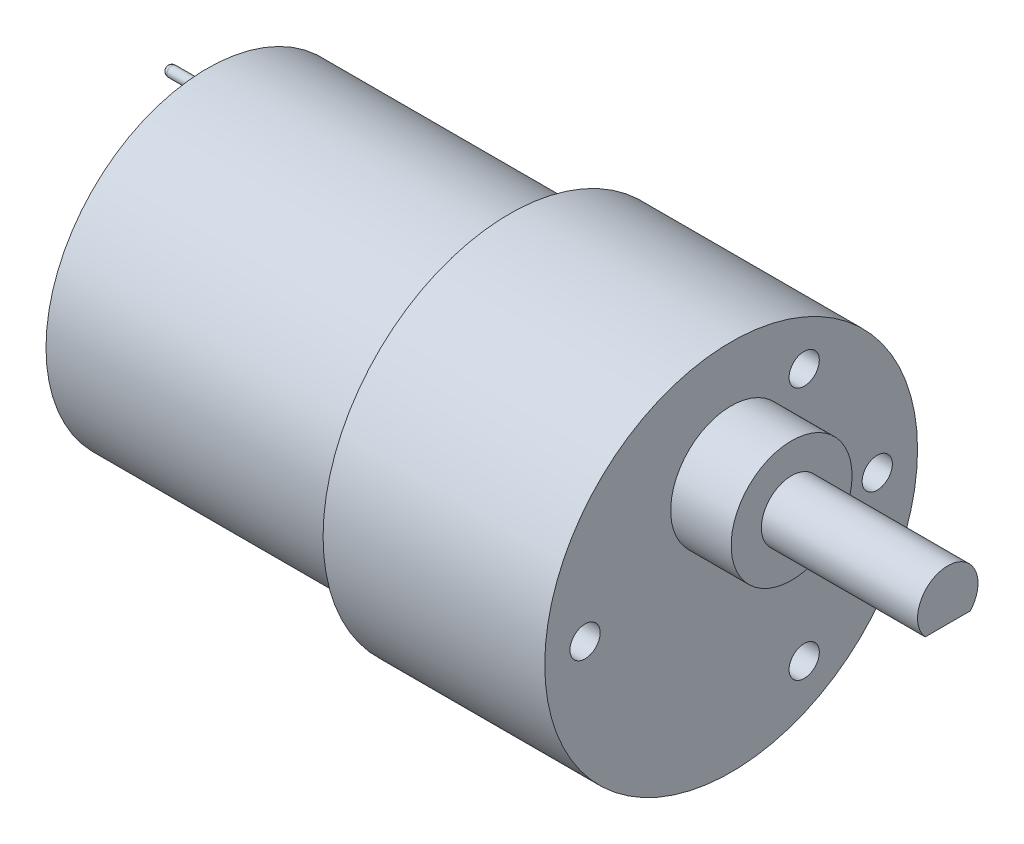
ISO-10303-21;
HEADER;
FILE_DESCRIPTION(('STEP AP214'),'2;1');
FILE_NAME('part.step','',(''),(''),'','','');
FILE_SCHEMA(('AUTOMOTIVE_DESIGN { 1 0 10303 214 1 1 1 1 }'));
ENDSEC;
DATA;
#1=APPLICATION_CONTEXT('core data for automotive mechanical design processes');
#2=APPLICATION_PROTOCOL_DEFINITION('international standard','automotive_design',2000,#1);
#3=PRODUCT_CONTEXT('',#1,'mechanical');
#4=PRODUCT('Part','Part','',(#3));
#5=PRODUCT_RELATED_PRODUCT_CATEGORY('part','',(#4));
#6=PRODUCT_DEFINITION_FORMATION('','',#4);
#7=PRODUCT_DEFINITION_CONTEXT('part definition',#1,'design');
#8=PRODUCT_DEFINITION('design','',#6,#7);
#9=PRODUCT_DEFINITION_SHAPE('','',#8);
#10=(LENGTH_UNIT() NAMED_UNIT(*) SI_UNIT(.MILLI.,.METRE.));
#11=(NAMED_UNIT(*) PLANE_ANGLE_UNIT() SI_UNIT($,.RADIAN.));
#12=(NAMED_UNIT(*) SI_UNIT($,.STERADIAN.) SOLID_ANGLE_UNIT());
#13=UNCERTAINTY_MEASURE_WITH_UNIT(LENGTH_MEASURE(1.E-05),#10,'distance_accuracy_value','');
#14=(GEOMETRIC_REPRESENTATION_CONTEXT(3) GLOBAL_UNCERTAINTY_ASSIGNED_CONTEXT((#13)) GLOBAL_UNIT_ASSIGNED_CONTEXT((#10,
#11,#12)) REPRESENTATION_CONTEXT('',''));
#15=CARTESIAN_POINT('',(0.,0.,0.));
#16=DIRECTION('',(0.,0.,1.));
#17=DIRECTION('',(1.,0.,0.));
#18=AXIS2_PLACEMENT_3D('',#15,#16,#17);
#19=CARTESIAN_POINT('',(52.,0.,0.));
#20=DIRECTION('',(1.,0.,0.));
#21=DIRECTION('',(0.,0.,-1.));
#22=AXIS2_PLACEMENT_3D('',#19,#20,#21);
#23=PLANE('',#22);
#24=CARTESIAN_POINT('',(52.,0.,-14.5));
#25=DIRECTION('',(1.,0.,0.));
#26=DIRECTION('',(0.,0.,-1.));
#27=AXIS2_PLACEMENT_3D('',#24,#25,#26);
#28=CIRCLE('',#27,1.5);
#29=CARTESIAN_POINT('',(52.,0.,-16.));
#30=VERTEX_POINT('',#29);
#31=EDGE_CURVE('E217',#30,#30,#28,.T.);
#32=ORIENTED_EDGE('',*,*,#31,.F.);
#33=EDGE_LOOP('',(#32));
#34=FACE_BOUND('',#33,.T.);
#35=CARTESIAN_POINT('',(52.,12.5573683548743,-7.25000000000006));
#36=DIRECTION('',(1.,0.,0.));
#37=DIRECTION('',(0.,0.,-1.));
#38=AXIS2_PLACEMENT_3D('',#35,#36,#37);
#39=CIRCLE('',#38,1.5);
#40=CARTESIAN_POINT('',(52.,12.5573683548743,-8.75000000000006));
#41=VERTEX_POINT('',#40);
#42=EDGE_CURVE('E231',#41,#41,#39,.T.);
#43=ORIENTED_EDGE('',*,*,#42,.F.);
#44=EDGE_LOOP('',(#43));
#45=FACE_BOUND('',#44,.T.);
#46=CARTESIAN_POINT('',(52.,-12.5573683548744,-7.24999999999988));
#47=DIRECTION('',(1.,0.,0.));
#48=DIRECTION('',(0.,0.,-1.));
#49=AXIS2_PLACEMENT_3D('',#46,#47,#48);
#50=CIRCLE('',#49,1.5);
#51=CARTESIAN_POINT('',(52.,-12.5573683548744,-8.74999999999988));
#52=VERTEX_POINT('',#51);
#53=EDGE_CURVE('E234',#52,#52,#50,.T.);
#54=ORIENTED_EDGE('',*,*,#53,.F.);
#55=EDGE_LOOP('',(#54));
#56=FACE_BOUND('',#55,.T.);
#57=CARTESIAN_POINT('',(52.,0.,14.5));
#58=DIRECTION('',(1.,0.,0.));
#59=DIRECTION('',(0.,0.,-1.));
#60=AXIS2_PLACEMENT_3D('',#57,#58,#59);
#61=CIRCLE('',#60,1.5);
#62=CARTESIAN_POINT('',(52.,0.,13.));
#63=VERTEX_POINT('',#62);
#64=EDGE_CURVE('E240',#63,#63,#61,.T.);
#65=ORIENTED_EDGE('',*,*,#64,.F.);
#66=EDGE_LOOP('',(#65));
#67=FACE_BOUND('',#66,.T.);
#68=CARTESIAN_POINT('',(52.,7.,0.));
#69=DIRECTION('',(1.,0.,0.));
#70=DIRECTION('',(0.,0.,-1.));
#71=AXIS2_PLACEMENT_3D('',#68,#69,#70);
#72=CIRCLE('',#71,6.);
#73=CARTESIAN_POINT('',(52.,7.,-6.));
#74=VERTEX_POINT('',#73);
#75=EDGE_CURVE('E79',#74,#74,#72,.T.);
#76=ORIENTED_EDGE('',*,*,#75,.F.);
#77=EDGE_LOOP('',(#76));
#78=FACE_BOUND('',#77,.T.);
#79=CARTESIAN_POINT('',(52.,0.,0.));
#80=DIRECTION('',(-1.,0.,0.));
#81=DIRECTION('',(0.,0.,1.));
#82=AXIS2_PLACEMENT_3D('',#79,#80,#81);
#83=CIRCLE('',#82,18.5);
#84=CARTESIAN_POINT('',(52.,0.,18.5));
#85=VERTEX_POINT('',#84);
#86=EDGE_CURVE('E89',#85,#85,#83,.T.);
#87=ORIENTED_EDGE('',*,*,#86,.F.);
#88=EDGE_LOOP('',(#87));
#89=FACE_BOUND('',#88,.T.);
#90=ADVANCED_FACE('F38',(#34,#45,#56,#67,#78,#89),#23,.T.);
#91=CARTESIAN_POINT('',(0.,0.,0.));
#92=DIRECTION('',(-1.,0.,0.));
#93=DIRECTION('',(0.,0.,1.));
#94=AXIS2_PLACEMENT_3D('',#91,#92,#93);
#95=CYLINDRICAL_SURFACE('',#94,18.5);
#96=ORIENTED_EDGE('',*,*,#86,.T.);
#97=EDGE_LOOP('',(#96));
#98=FACE_BOUND('',#97,.T.);
#99=CARTESIAN_POINT('',(30.,0.,0.));
#100=DIRECTION('',(-1.,0.,0.));
#101=DIRECTION('',(0.,0.,1.));
#102=AXIS2_PLACEMENT_3D('',#99,#100,#101);
#103=CIRCLE('',#102,18.5);
#104=CARTESIAN_POINT('',(30.,0.,18.5));
#105=VERTEX_POINT('',#104);
#106=EDGE_CURVE('E101',#105,#105,#103,.T.);
#107=ORIENTED_EDGE('',*,*,#106,.F.);
#108=EDGE_LOOP('',(#107));
#109=FACE_BOUND('',#108,.T.);
#110=ADVANCED_FACE('F122',(#98,#109),#95,.T.);
#111=CARTESIAN_POINT('',(30.,0.,0.));
#112=DIRECTION('',(-1.,0.,0.));
#113=DIRECTION('',(0.,0.,1.));
#114=AXIS2_PLACEMENT_3D('',#111,#112,#113);
#115=PLANE('',#114);
#116=ORIENTED_EDGE('',*,*,#106,.T.);
#117=EDGE_LOOP('',(#116));
#118=FACE_BOUND('',#117,.T.);
#119=CARTESIAN_POINT('',(30.,0.,0.));
#120=DIRECTION('',(-1.,0.,0.));
#121=DIRECTION('',(0.,0.,1.));
#122=AXIS2_PLACEMENT_3D('',#119,#120,#121);
#123=CIRCLE('',#122,16.);
#124=CARTESIAN_POINT('',(30.,0.,16.));
#125=VERTEX_POINT('',#124);
#126=EDGE_CURVE('E98',#125,#125,#123,.T.);
#127=ORIENTED_EDGE('',*,*,#126,.F.);
#128=EDGE_LOOP('',(#127));
#129=FACE_BOUND('',#128,.T.);
#130=ADVANCED_FACE('F128',(#118,#129),#115,.T.);
#131=CARTESIAN_POINT('',(0.,0.,0.));
#132=DIRECTION('',(-1.,0.,0.));
#133=DIRECTION('',(0.,0.,1.));
#134=AXIS2_PLACEMENT_3D('',#131,#132,#133);
#135=CYLINDRICAL_SURFACE('',#134,16.);
#136=ORIENTED_EDGE('',*,*,#126,.T.);
#137=EDGE_LOOP('',(#136));
#138=FACE_BOUND('',#137,.T.);
#139=CARTESIAN_POINT('',(0.,0.,0.));
#140=DIRECTION('',(-1.,0.,0.));
#141=DIRECTION('',(0.,0.,1.));
#142=AXIS2_PLACEMENT_3D('',#139,#140,#141);
#143=CIRCLE('',#142,16.);
#144=CARTESIAN_POINT('',(0.,0.,16.));
#145=VERTEX_POINT('',#144);
#146=EDGE_CURVE('E95',#145,#145,#143,.T.);
#147=ORIENTED_EDGE('',*,*,#146,.F.);
#148=EDGE_LOOP('',(#147));
#149=FACE_BOUND('',#148,.T.);
#150=ADVANCED_FACE('F146',(#138,#149),#135,.T.);
#151=CARTESIAN_POINT('',(0.,0.,0.));
#152=DIRECTION('',(-1.,0.,0.));
#153=DIRECTION('',(0.,0.,1.));
#154=AXIS2_PLACEMENT_3D('',#151,#152,#153);
#155=PLANE('',#154);
#156=CARTESIAN_POINT('',(0.,-14.,0.));
#157=DIRECTION('',(-1.,0.,0.));
#158=DIRECTION('',(0.,0.,1.));
#159=AXIS2_PLACEMENT_3D('',#156,#157,#158);
#160=CIRCLE('',#159,0.5);
#161=CARTESIAN_POINT('',(0.,-14.,0.500000000000002));
#162=VERTEX_POINT('',#161);
#163=EDGE_CURVE('E218',#162,#162,#160,.T.);
#164=ORIENTED_EDGE('',*,*,#163,.F.);
#165=EDGE_LOOP('',(#164));
#166=FACE_BOUND('',#165,.T.);
#167=CARTESIAN_POINT('',(0.,14.,0.));
#168=DIRECTION('',(-1.,0.,0.));
#169=DIRECTION('',(0.,0.,1.));
#170=AXIS2_PLACEMENT_3D('',#167,#168,#169);
#171=CIRCLE('',#170,0.5);
#172=CARTESIAN_POINT('',(0.,14.,0.5));
#173=VERTEX_POINT('',#172);
#174=EDGE_CURVE('E215',#173,#173,#171,.T.);
#175=ORIENTED_EDGE('',*,*,#174,.F.);
#176=EDGE_LOOP('',(#175));
#177=FACE_BOUND('',#176,.T.);
#178=CARTESIAN_POINT('',(0.,0.,0.));
#179=DIRECTION('',(-1.,0.,0.));
#180=DIRECTION('',(0.,0.,1.));
#181=AXIS2_PLACEMENT_3D('',#178,#179,#180);
#182=CIRCLE('',#181,2.);
#183=CARTESIAN_POINT('',(0.,0.,2.));
#184=VERTEX_POINT('',#183);
#185=EDGE_CURVE('E91',#184,#184,#182,.T.);
#186=ORIENTED_EDGE('',*,*,#185,.F.);
#187=EDGE_LOOP('',(#186));
#188=FACE_BOUND('',#187,.T.);
#189=ORIENTED_EDGE('',*,*,#146,.T.);
#190=EDGE_LOOP('',(#189));
#191=FACE_BOUND('',#190,.T.);
#192=ADVANCED_FACE('F137',(#166,#177,#188,#191),#155,.T.);
#193=CARTESIAN_POINT('',(0.,0.,0.));
#194=DIRECTION('',(-1.,0.,0.));
#195=DIRECTION('',(0.,0.,1.));
#196=AXIS2_PLACEMENT_3D('',#193,#194,#195);
#197=SPHERICAL_SURFACE('',#196,2.);
#198=ORIENTED_EDGE('',*,*,#185,.T.);
#199=EDGE_LOOP('',(#198));
#200=FACE_BOUND('',#199,.T.);
#201=ADVANCED_FACE('F134',(#200),#197,.T.);
#202=CARTESIAN_POINT('',(58.,7.,0.));
#203=DIRECTION('',(-1.,0.,0.));
#204=DIRECTION('',(0.,0.,1.));
#205=AXIS2_PLACEMENT_3D('',#202,#203,#204);
#206=CYLINDRICAL_SURFACE('',#205,6.);
#207=CARTESIAN_POINT('',(58.,7.,0.));
#208=DIRECTION('',(1.,0.,0.));
#209=DIRECTION('',(0.,0.,-1.));
#210=AXIS2_PLACEMENT_3D('',#207,#208,#209);
#211=CIRCLE('',#210,6.);
#212=CARTESIAN_POINT('',(58.,7.,-6.));
#213=VERTEX_POINT('',#212);
#214=EDGE_CURVE('E82',#213,#213,#211,.T.);
#215=ORIENTED_EDGE('',*,*,#214,.F.);
#216=EDGE_LOOP('',(#215));
#217=FACE_BOUND('',#216,.T.);
#218=ORIENTED_EDGE('',*,*,#75,.T.);
#219=EDGE_LOOP('',(#218));
#220=FACE_BOUND('',#219,.T.);
#221=ADVANCED_FACE('F136',(#217,#220),#206,.T.);
#222=CARTESIAN_POINT('',(58.,0.,0.));
#223=DIRECTION('',(1.,0.,0.));
#224=DIRECTION('',(0.,0.,-1.));
#225=AXIS2_PLACEMENT_3D('',#222,#223,#224);
#226=PLANE('',#225);
#227=CARTESIAN_POINT('',(58.,7.,0.));
#228=DIRECTION('',(1.,0.,0.));
#229=DIRECTION('',(0.,0.,-1.));
#230=AXIS2_PLACEMENT_3D('',#227,#228,#229);
#231=CIRCLE('',#230,3.);
#232=CARTESIAN_POINT('',(58.,7.,-3.));
#233=VERTEX_POINT('',#232);
#234=EDGE_CURVE('E86',#233,#233,#231,.T.);
#235=ORIENTED_EDGE('',*,*,#234,.F.);
#236=EDGE_LOOP('',(#235));
#237=FACE_BOUND('',#236,.T.);
#238=ORIENTED_EDGE('',*,*,#214,.T.);
#239=EDGE_LOOP('',(#238));
#240=FACE_BOUND('',#239,.T.);
#241=ADVANCED_FACE('F143',(#237,#240),#226,.T.);
#242=CARTESIAN_POINT('',(73.5,7.,0.));
#243=DIRECTION('',(-1.,0.,0.));
#244=DIRECTION('',(0.,0.,1.));
#245=AXIS2_PLACEMENT_3D('',#242,#243,#244);
#246=CYLINDRICAL_SURFACE('',#245,3.);
#247=CARTESIAN_POINT('',(73.5,7.,0.));
#248=DIRECTION('',(1.,0.,0.));
#249=DIRECTION('',(0.,0.,-1.));
#250=AXIS2_PLACEMENT_3D('',#247,#248,#249);
#251=CIRCLE('',#250,3.);
#252=CARTESIAN_POINT('',(73.5,5.,-2.23606797749979));
#253=VERTEX_POINT('',#252);
#254=CARTESIAN_POINT('',(73.5,5.,2.23606797749979));
#255=VERTEX_POINT('',#254);
#256=EDGE_CURVE('E76',#253,#255,#251,.T.);
#257=ORIENTED_EDGE('',*,*,#256,.F.);
#258=DIRECTION('',(1.,0.,0.));
#259=VECTOR('',#258,1.);
#260=CARTESIAN_POINT('',(61.5,5.,-2.23606797749979));
#261=LINE('',#260,#259);
#262=CARTESIAN_POINT('',(61.5,5.,-2.23606797749979));
#263=VERTEX_POINT('',#262);
#264=EDGE_CURVE('E53',#263,#253,#261,.T.);
#265=ORIENTED_EDGE('',*,*,#264,.F.);
#266=CARTESIAN_POINT('',(61.5,7.,0.));
#267=DIRECTION('',(1.,0.,0.));
#268=DIRECTION('',(0.,0.,-1.));
#269=AXIS2_PLACEMENT_3D('',#266,#267,#268);
#270=CIRCLE('',#269,3.);
#271=CARTESIAN_POINT('',(61.5,5.,2.23606797749979));
#272=VERTEX_POINT('',#271);
#273=EDGE_CURVE('E69',#272,#263,#270,.T.);
#274=ORIENTED_EDGE('',*,*,#273,.F.);
#275=DIRECTION('',(1.,0.,0.));
#276=VECTOR('',#275,1.);
#277=CARTESIAN_POINT('',(61.5,5.,2.23606797749979));
#278=LINE('',#277,#276);
#279=EDGE_CURVE('E59',#272,#255,#278,.T.);
#280=ORIENTED_EDGE('',*,*,#279,.T.);
#281=EDGE_LOOP('',(#257,#265,#274,#280));
#282=FACE_BOUND('',#281,.T.);
#283=ORIENTED_EDGE('',*,*,#234,.T.);
#284=EDGE_LOOP('',(#283));
#285=FACE_BOUND('',#284,.T.);
#286=ADVANCED_FACE('F74',(#282,#285),#246,.T.);
#287=CARTESIAN_POINT('',(73.5,0.,0.));
#288=DIRECTION('',(1.,0.,0.));
#289=DIRECTION('',(0.,0.,-1.));
#290=AXIS2_PLACEMENT_3D('',#287,#288,#289);
#291=PLANE('',#290);
#292=DIRECTION('',(0.,0.,1.));
#293=VECTOR('',#292,1.);
#294=CARTESIAN_POINT('',(73.5,5.,0.));
#295=LINE('',#294,#293);
#296=EDGE_CURVE('E64',#253,#255,#295,.T.);
#297=ORIENTED_EDGE('',*,*,#296,.F.);
#298=ORIENTED_EDGE('',*,*,#256,.T.);
#299=EDGE_LOOP('',(#297,#298));
#300=FACE_BOUND('',#299,.T.);
#301=ADVANCED_FACE('F78',(#300),#291,.T.);
#302=CARTESIAN_POINT('',(61.5,5.,0.));
#303=DIRECTION('',(0.,1.,0.));
#304=DIRECTION('',(0.,0.,1.));
#305=AXIS2_PLACEMENT_3D('',#302,#303,#304);
#306=PLANE('',#305);
#307=ORIENTED_EDGE('',*,*,#296,.T.);
#308=ORIENTED_EDGE('',*,*,#279,.F.);
#309=DIRECTION('',(0.,0.,1.));
#310=VECTOR('',#309,1.);
#311=CARTESIAN_POINT('',(61.5,5.,0.));
#312=LINE('',#311,#310);
#313=EDGE_CURVE('E246',#263,#272,#312,.T.);
#314=ORIENTED_EDGE('',*,*,#313,.F.);
#315=ORIENTED_EDGE('',*,*,#264,.T.);
#316=EDGE_LOOP('',(#307,#308,#314,#315));
#317=FACE_BOUND('',#316,.T.);
#318=ADVANCED_FACE('F65',(#317),#306,.F.);
#319=CARTESIAN_POINT('',(61.5,0.,0.));
#320=DIRECTION('',(1.,0.,0.));
#321=DIRECTION('',(0.,0.,-1.));
#322=AXIS2_PLACEMENT_3D('',#319,#320,#321);
#323=PLANE('',#322);
#324=ORIENTED_EDGE('',*,*,#273,.T.);
#325=ORIENTED_EDGE('',*,*,#313,.T.);
#326=EDGE_LOOP('',(#324,#325));
#327=FACE_BOUND('',#326,.T.);
#328=ADVANCED_FACE('F171',(#327),#323,.T.);
#329=CARTESIAN_POINT('',(47.,0.,14.5));
#330=DIRECTION('',(1.,0.,0.));
#331=DIRECTION('',(0.,0.,-1.));
#332=AXIS2_PLACEMENT_3D('',#329,#330,#331);
#333=CYLINDRICAL_SURFACE('',#332,1.5);
#334=CARTESIAN_POINT('',(47.,0.,14.5));
#335=DIRECTION('',(1.,0.,0.));
#336=DIRECTION('',(0.,0.,-1.));
#337=AXIS2_PLACEMENT_3D('',#334,#335,#336);
#338=CIRCLE('',#337,1.5);
#339=CARTESIAN_POINT('',(47.,0.,13.));
#340=VERTEX_POINT('',#339);
#341=EDGE_CURVE('E227',#340,#340,#338,.T.);
#342=ORIENTED_EDGE('',*,*,#341,.F.);
#343=EDGE_LOOP('',(#342));
#344=FACE_BOUND('',#343,.T.);
#345=ORIENTED_EDGE('',*,*,#64,.T.);
#346=EDGE_LOOP('',(#345));
#347=FACE_BOUND('',#346,.T.);
#348=ADVANCED_FACE('F174',(#344,#347),#333,.F.);
#349=CARTESIAN_POINT('',(47.,0.,14.5));
#350=DIRECTION('',(1.,0.,0.));
#351=DIRECTION('',(0.,0.,-1.));
#352=AXIS2_PLACEMENT_3D('',#349,#350,#351);
#353=PLANE('',#352);
#354=ORIENTED_EDGE('',*,*,#341,.T.);
#355=EDGE_LOOP('',(#354));
#356=FACE_BOUND('',#355,.T.);
#357=ADVANCED_FACE('F176',(#356),#353,.T.);
#358=CARTESIAN_POINT('',(47.,-12.5573683548744,-7.24999999999988));
#359=DIRECTION('',(1.,0.,0.));
#360=DIRECTION('',(0.,0.,-1.));
#361=AXIS2_PLACEMENT_3D('',#358,#359,#360);
#362=CYLINDRICAL_SURFACE('',#361,1.5);
#363=CARTESIAN_POINT('',(47.,-12.5573683548744,-7.24999999999988));
#364=DIRECTION('',(1.,0.,0.));
#365=DIRECTION('',(0.,0.,-1.));
#366=AXIS2_PLACEMENT_3D('',#363,#364,#365);
#367=CIRCLE('',#366,1.5);
#368=CARTESIAN_POINT('',(47.,-12.5573683548744,-8.74999999999988));
#369=VERTEX_POINT('',#368);
#370=EDGE_CURVE('E237',#369,#369,#367,.T.);
#371=ORIENTED_EDGE('',*,*,#370,.F.);
#372=EDGE_LOOP('',(#371));
#373=FACE_BOUND('',#372,.T.);
#374=ORIENTED_EDGE('',*,*,#53,.T.);
#375=EDGE_LOOP('',(#374));
#376=FACE_BOUND('',#375,.T.);
#377=ADVANCED_FACE('F179',(#373,#376),#362,.F.);
#378=CARTESIAN_POINT('',(47.,-12.5573683548744,-7.24999999999988));
#379=DIRECTION('',(1.,0.,0.));
#380=DIRECTION('',(0.,0.,-1.));
#381=AXIS2_PLACEMENT_3D('',#378,#379,#380);
#382=PLANE('',#381);
#383=ORIENTED_EDGE('',*,*,#370,.T.);
#384=EDGE_LOOP('',(#383));
#385=FACE_BOUND('',#384,.T.);
#386=ADVANCED_FACE('F184',(#385),#382,.T.);
#387=CARTESIAN_POINT('',(47.,12.5573683548743,-7.25000000000006));
#388=DIRECTION('',(1.,0.,0.));
#389=DIRECTION('',(0.,0.,-1.));
#390=AXIS2_PLACEMENT_3D('',#387,#388,#389);
#391=CYLINDRICAL_SURFACE('',#390,1.5);
#392=CARTESIAN_POINT('',(47.,12.5573683548743,-7.25000000000006));
#393=DIRECTION('',(1.,0.,0.));
#394=DIRECTION('',(0.,0.,-1.));
#395=AXIS2_PLACEMENT_3D('',#392,#393,#394);
#396=CIRCLE('',#395,1.5);
#397=CARTESIAN_POINT('',(47.,12.5573683548743,-8.75000000000006));
#398=VERTEX_POINT('',#397);
#399=EDGE_CURVE('E70',#398,#398,#396,.T.);
#400=ORIENTED_EDGE('',*,*,#399,.F.);
#401=EDGE_LOOP('',(#400));
#402=FACE_BOUND('',#401,.T.);
#403=ORIENTED_EDGE('',*,*,#42,.T.);
#404=EDGE_LOOP('',(#403));
#405=FACE_BOUND('',#404,.T.);
#406=ADVANCED_FACE('F187',(#402,#405),#391,.F.);
#407=CARTESIAN_POINT('',(47.,12.5573683548743,-7.25000000000006));
#408=DIRECTION('',(1.,0.,0.));
#409=DIRECTION('',(0.,0.,-1.));
#410=AXIS2_PLACEMENT_3D('',#407,#408,#409);
#411=PLANE('',#410);
#412=ORIENTED_EDGE('',*,*,#399,.T.);
#413=EDGE_LOOP('',(#412));
#414=FACE_BOUND('',#413,.T.);
#415=ADVANCED_FACE('F194',(#414),#411,.T.);
#416=CARTESIAN_POINT('',(47.,0.,-14.5));
#417=DIRECTION('',(1.,0.,0.));
#418=DIRECTION('',(0.,0.,-1.));
#419=AXIS2_PLACEMENT_3D('',#416,#417,#418);
#420=CYLINDRICAL_SURFACE('',#419,1.5);
#421=CARTESIAN_POINT('',(47.,0.,-14.5));
#422=DIRECTION('',(1.,0.,0.));
#423=DIRECTION('',(0.,0.,-1.));
#424=AXIS2_PLACEMENT_3D('',#421,#422,#423);
#425=CIRCLE('',#424,1.5);
#426=CARTESIAN_POINT('',(47.,0.,-16.));
#427=VERTEX_POINT('',#426);
#428=EDGE_CURVE('E221',#427,#427,#425,.T.);
#429=ORIENTED_EDGE('',*,*,#428,.F.);
#430=EDGE_LOOP('',(#429));
#431=FACE_BOUND('',#430,.T.);
#432=ORIENTED_EDGE('',*,*,#31,.T.);
#433=EDGE_LOOP('',(#432));
#434=FACE_BOUND('',#433,.T.);
#435=ADVANCED_FACE('F198',(#431,#434),#420,.F.);
#436=CARTESIAN_POINT('',(47.,0.,-14.5));
#437=DIRECTION('',(1.,0.,0.));
#438=DIRECTION('',(0.,0.,-1.));
#439=AXIS2_PLACEMENT_3D('',#436,#437,#438);
#440=PLANE('',#439);
#441=ORIENTED_EDGE('',*,*,#428,.T.);
#442=EDGE_LOOP('',(#441));
#443=FACE_BOUND('',#442,.T.);
#444=ADVANCED_FACE('F202',(#443),#440,.T.);
#445=CARTESIAN_POINT('',(-4.,14.,0.));
#446=DIRECTION('',(1.,0.,0.));
#447=DIRECTION('',(0.,0.,-1.));
#448=AXIS2_PLACEMENT_3D('',#445,#446,#447);
#449=CYLINDRICAL_SURFACE('',#448,0.5);
#450=CARTESIAN_POINT('',(-3.5,14.,0.));
#451=DIRECTION('',(1.,0.,0.));
#452=DIRECTION('',(0.,0.,-1.));
#453=AXIS2_PLACEMENT_3D('',#450,#451,#452);
#454=CIRCLE('',#453,0.5);
#455=CARTESIAN_POINT('',(-3.5,14.,-0.5));
#456=VERTEX_POINT('',#455);
#457=EDGE_CURVE('E11',#456,#456,#454,.T.);
#458=ORIENTED_EDGE('',*,*,#457,.T.);
#459=EDGE_LOOP('',(#458));
#460=FACE_BOUND('',#459,.T.);
#461=ORIENTED_EDGE('',*,*,#174,.T.);
#462=EDGE_LOOP('',(#461));
#463=FACE_BOUND('',#462,.T.);
#464=ADVANCED_FACE('F118',(#460,#463),#449,.T.);
#465=CARTESIAN_POINT('',(-4.,-14.,0.));
#466=DIRECTION('',(1.,0.,0.));
#467=DIRECTION('',(0.,0.,-1.));
#468=AXIS2_PLACEMENT_3D('',#465,#466,#467);
#469=CYLINDRICAL_SURFACE('',#468,0.5);
#470=CARTESIAN_POINT('',(-3.5,-14.,0.));
#471=DIRECTION('',(1.,0.,0.));
#472=DIRECTION('',(0.,0.,-1.));
#473=AXIS2_PLACEMENT_3D('',#470,#471,#472);
#474=CIRCLE('',#473,0.5);
#475=CARTESIAN_POINT('',(-3.5,-14.,-0.499999999999998));
#476=VERTEX_POINT('',#475);
#477=EDGE_CURVE('E46',#476,#476,#474,.T.);
#478=ORIENTED_EDGE('',*,*,#477,.T.);
#479=EDGE_LOOP('',(#478));
#480=FACE_BOUND('',#479,.T.);
#481=ORIENTED_EDGE('',*,*,#163,.T.);
#482=EDGE_LOOP('',(#481));
#483=FACE_BOUND('',#482,.T.);
#484=ADVANCED_FACE('F108',(#480,#483),#469,.T.);
#485=CARTESIAN_POINT('',(-3.5,-14.,0.));
#486=DIRECTION('',(-1.,0.,0.));
#487=DIRECTION('',(0.,0.,1.));
#488=AXIS2_PLACEMENT_3D('',#485,#486,#487);
#489=SPHERICAL_SURFACE('',#488,0.5);
#490=ORIENTED_EDGE('',*,*,#477,.F.);
#491=EDGE_LOOP('',(#490));
#492=FACE_BOUND('',#491,.T.);
#493=ADVANCED_FACE('F111',(#492),#489,.T.);
#494=CARTESIAN_POINT('',(-3.5,14.,0.));
#495=DIRECTION('',(-1.,0.,0.));
#496=DIRECTION('',(0.,0.,1.));
#497=AXIS2_PLACEMENT_3D('',#494,#495,#496);
#498=SPHERICAL_SURFACE('',#497,0.5);
#499=ORIENTED_EDGE('',*,*,#457,.F.);
#500=EDGE_LOOP('',(#499));
#501=FACE_BOUND('',#500,.T.);
#502=ADVANCED_FACE('F40',(#501),#498,.T.);
#503=CLOSED_SHELL('',(#90,#110,#130,#150,#192,#201,#221,#241,#286,#301,#318,#328,#348,#357,#377,
#386,#406,#415,#435,#444,#464,#484,#493,#502));
#504=MANIFOLD_SOLID_BREP('B2',#503);
#505=ADVANCED_BREP_SHAPE_REPRESENTATION('',(#18,#504),#14);
#506=SHAPE_DEFINITION_REPRESENTATION(#9,#505);
ENDSEC;
END-ISO-10303-21;
